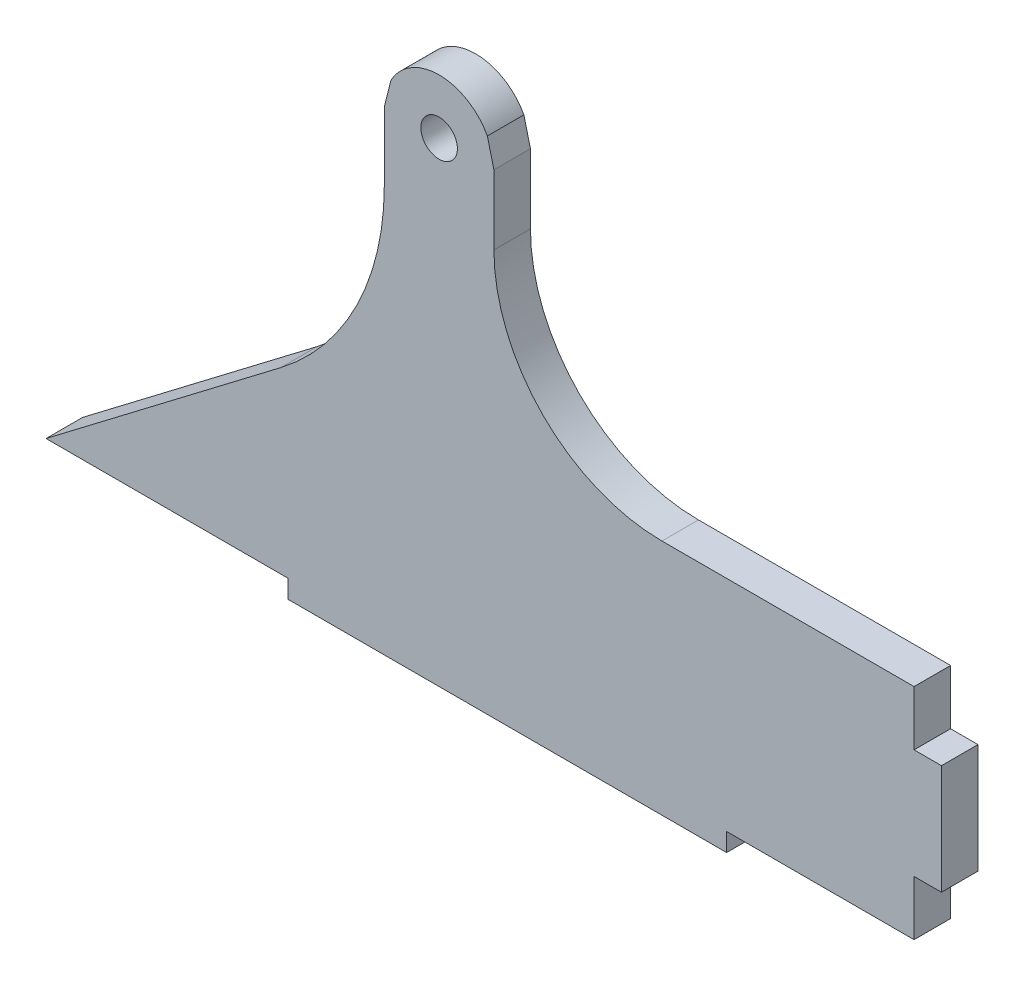
ISO-10303-21;
HEADER;
FILE_DESCRIPTION(('STEP AP214'),'2;1');
FILE_NAME('part.step','',(''),(''),'','','');
FILE_SCHEMA(('AUTOMOTIVE_DESIGN { 1 0 10303 214 1 1 1 1 }'));
ENDSEC;
DATA;
#1=APPLICATION_CONTEXT('core data for automotive mechanical design processes');
#2=APPLICATION_PROTOCOL_DEFINITION('international standard','automotive_design',2000,#1);
#3=PRODUCT_CONTEXT('',#1,'mechanical');
#4=PRODUCT('Part','Part','',(#3));
#5=PRODUCT_RELATED_PRODUCT_CATEGORY('part','',(#4));
#6=PRODUCT_DEFINITION_FORMATION('','',#4);
#7=PRODUCT_DEFINITION_CONTEXT('part definition',#1,'design');
#8=PRODUCT_DEFINITION('design','',#6,#7);
#9=PRODUCT_DEFINITION_SHAPE('','',#8);
#10=(LENGTH_UNIT() NAMED_UNIT(*) SI_UNIT(.MILLI.,.METRE.));
#11=(NAMED_UNIT(*) PLANE_ANGLE_UNIT() SI_UNIT($,.RADIAN.));
#12=(NAMED_UNIT(*) SI_UNIT($,.STERADIAN.) SOLID_ANGLE_UNIT());
#13=UNCERTAINTY_MEASURE_WITH_UNIT(LENGTH_MEASURE(1.E-05),#10,'distance_accuracy_value','');
#14=(GEOMETRIC_REPRESENTATION_CONTEXT(3) GLOBAL_UNCERTAINTY_ASSIGNED_CONTEXT((#13)) GLOBAL_UNIT_ASSIGNED_CONTEXT((#10,
#11,#12)) REPRESENTATION_CONTEXT('',''));
#15=CARTESIAN_POINT('',(0.,0.,0.));
#16=DIRECTION('',(0.,0.,1.));
#17=DIRECTION('',(1.,0.,0.));
#18=AXIS2_PLACEMENT_3D('',#15,#16,#17);
#19=CARTESIAN_POINT('',(-54.3464769765245,0.,12.7));
#20=DIRECTION('',(1.,0.,0.));
#21=DIRECTION('',(0.,1.,0.));
#22=AXIS2_PLACEMENT_3D('',#19,#20,#21);
#23=PLANE('',#22);
#24=DIRECTION('',(0.,-1.,0.));
#25=VECTOR('',#24,1.);
#26=CARTESIAN_POINT('',(-54.3464769765245,0.,0.));
#27=LINE('',#26,#25);
#28=CARTESIAN_POINT('',(-54.3464769765246,115.328667430171,0.));
#29=VERTEX_POINT('',#28);
#30=CARTESIAN_POINT('',(-54.3464769765246,91.4382890086782,0.));
#31=VERTEX_POINT('',#30);
#32=EDGE_CURVE('E204',#29,#31,#27,.T.);
#33=ORIENTED_EDGE('',*,*,#32,.T.);
#34=DIRECTION('',(0.,0.,-1.));
#35=VECTOR('',#34,1.);
#36=CARTESIAN_POINT('',(-54.3464769765246,91.4382890086782,12.7));
#37=LINE('',#36,#35);
#38=CARTESIAN_POINT('',(-54.3464769765246,91.4382890086782,12.7));
#39=VERTEX_POINT('',#38);
#40=EDGE_CURVE('E11',#39,#31,#37,.T.);
#41=ORIENTED_EDGE('',*,*,#40,.F.);
#42=DIRECTION('',(0.,-1.,0.));
#43=VECTOR('',#42,1.);
#44=CARTESIAN_POINT('',(-54.3464769765245,0.,12.7));
#45=LINE('',#44,#43);
#46=CARTESIAN_POINT('',(-54.3464769765246,115.328667430171,12.7));
#47=VERTEX_POINT('',#46);
#48=EDGE_CURVE('E345',#47,#39,#45,.T.);
#49=ORIENTED_EDGE('',*,*,#48,.F.);
#50=DIRECTION('',(0.,0.,-1.));
#51=VECTOR('',#50,1.);
#52=CARTESIAN_POINT('',(-54.3464769765246,115.328667430171,12.7));
#53=LINE('',#52,#51);
#54=EDGE_CURVE('E197',#47,#29,#53,.T.);
#55=ORIENTED_EDGE('',*,*,#54,.T.);
#56=EDGE_LOOP('',(#33,#41,#49,#55));
#57=FACE_BOUND('',#56,.T.);
#58=ADVANCED_FACE('F38',(#57),#23,.F.);
#59=CARTESIAN_POINT('',(-145.786476976525,91.4382890086777,12.7));
#60=DIRECTION('',(0.,0.,-1.));
#61=DIRECTION('',(-1.,0.,0.));
#62=AXIS2_PLACEMENT_3D('',#59,#60,#61);
#63=CYLINDRICAL_SURFACE('',#62,91.44);
#64=CARTESIAN_POINT('',(-145.786476976525,91.4382890086777,0.));
#65=DIRECTION('',(0.,0.,1.));
#66=DIRECTION('',(1.,0.,0.));
#67=AXIS2_PLACEMENT_3D('',#64,#65,#66);
#68=CIRCLE('',#67,91.44);
#69=CARTESIAN_POINT('',(-90.3866865866166,18.6912146705694,0.));
#70=VERTEX_POINT('',#69);
#71=EDGE_CURVE('E207',#31,#70,#68,.F.);
#72=ORIENTED_EDGE('',*,*,#71,.T.);
#73=DIRECTION('',(0.,0.,-1.));
#74=VECTOR('',#73,1.);
#75=CARTESIAN_POINT('',(-90.3866865866166,18.6912146705694,12.7));
#76=LINE('',#75,#74);
#77=CARTESIAN_POINT('',(-90.3866865866166,18.6912146705694,12.7));
#78=VERTEX_POINT('',#77);
#79=EDGE_CURVE('E47',#78,#70,#76,.T.);
#80=ORIENTED_EDGE('',*,*,#79,.F.);
#81=CARTESIAN_POINT('',(-145.786476976525,91.4382890086777,12.7));
#82=DIRECTION('',(0.,0.,1.));
#83=DIRECTION('',(1.,0.,0.));
#84=AXIS2_PLACEMENT_3D('',#81,#82,#83);
#85=CIRCLE('',#84,91.44);
#86=EDGE_CURVE('E131',#39,#78,#85,.F.);
#87=ORIENTED_EDGE('',*,*,#86,.F.);
#88=ORIENTED_EDGE('',*,*,#40,.T.);
#89=EDGE_LOOP('',(#72,#80,#87,#88));
#90=FACE_BOUND('',#89,.T.);
#91=ADVANCED_FACE('F359',(#90),#63,.F.);
#92=CARTESIAN_POINT('',(-42.187104883936,55.3971131208522,12.7));
#93=DIRECTION('',(0.605859474955253,-0.795571679113168,0.));
#94=DIRECTION('',(0.795571679113168,0.605859474955253,0.));
#95=AXIS2_PLACEMENT_3D('',#92,#93,#94);
#96=PLANE('',#95);
#97=DIRECTION('',(-0.795571679113168,-0.605859474955253,0.));
#98=VECTOR('',#97,1.);
#99=CARTESIAN_POINT('',(-42.187104883936,55.3971131208522,0.));
#100=LINE('',#99,#98);
#101=CARTESIAN_POINT('',(-171.948476976525,-43.4213325698294,0.));
#102=VERTEX_POINT('',#101);
#103=EDGE_CURVE('E209',#70,#102,#100,.T.);
#104=ORIENTED_EDGE('',*,*,#103,.T.);
#105=DIRECTION('',(0.,0.,-1.));
#106=VECTOR('',#105,1.);
#107=CARTESIAN_POINT('',(-171.948476976525,-43.4213325698294,12.7));
#108=LINE('',#107,#106);
#109=CARTESIAN_POINT('',(-171.948476976525,-43.4213325698294,12.7));
#110=VERTEX_POINT('',#109);
#111=EDGE_CURVE('E280',#110,#102,#108,.T.);
#112=ORIENTED_EDGE('',*,*,#111,.F.);
#113=DIRECTION('',(-0.795571679113168,-0.605859474955253,0.));
#114=VECTOR('',#113,1.);
#115=CARTESIAN_POINT('',(-42.187104883936,55.3971131208522,12.7));
#116=LINE('',#115,#114);
#117=EDGE_CURVE('E288',#78,#110,#116,.T.);
#118=ORIENTED_EDGE('',*,*,#117,.F.);
#119=ORIENTED_EDGE('',*,*,#79,.T.);
#120=EDGE_LOOP('',(#104,#112,#118,#119));
#121=FACE_BOUND('',#120,.T.);
#122=ADVANCED_FACE('F286',(#121),#96,.F.);
#123=CARTESIAN_POINT('',(0.,-43.4213325698294,12.7));
#124=DIRECTION('',(0.,1.,0.));
#125=DIRECTION('',(0.,0.,1.));
#126=AXIS2_PLACEMENT_3D('',#123,#124,#125);
#127=PLANE('',#126);
#128=DIRECTION('',(1.,0.,0.));
#129=VECTOR('',#128,1.);
#130=CARTESIAN_POINT('',(0.,-43.4213325698294,0.));
#131=LINE('',#130,#129);
#132=CARTESIAN_POINT('',(-87.7474769765246,-43.4213325698294,0.));
#133=VERTEX_POINT('',#132);
#134=EDGE_CURVE('E211',#102,#133,#131,.T.);
#135=ORIENTED_EDGE('',*,*,#134,.T.);
#136=DIRECTION('',(0.,0.,-1.));
#137=VECTOR('',#136,1.);
#138=CARTESIAN_POINT('',(-87.7474769765246,-43.4213325698294,12.7));
#139=LINE('',#138,#137);
#140=CARTESIAN_POINT('',(-87.7474769765246,-43.4213325698294,12.7));
#141=VERTEX_POINT('',#140);
#142=EDGE_CURVE('E277',#141,#133,#139,.T.);
#143=ORIENTED_EDGE('',*,*,#142,.F.);
#144=DIRECTION('',(1.,0.,0.));
#145=VECTOR('',#144,1.);
#146=CARTESIAN_POINT('',(0.,-43.4213325698294,12.7));
#147=LINE('',#146,#145);
#148=EDGE_CURVE('E306',#110,#141,#147,.T.);
#149=ORIENTED_EDGE('',*,*,#148,.F.);
#150=ORIENTED_EDGE('',*,*,#111,.T.);
#151=EDGE_LOOP('',(#135,#143,#149,#150));
#152=FACE_BOUND('',#151,.T.);
#153=ADVANCED_FACE('F297',(#152),#127,.F.);
#154=CARTESIAN_POINT('',(-87.7474769765246,0.,12.7));
#155=DIRECTION('',(1.,0.,0.));
#156=DIRECTION('',(0.,0.,-1.));
#157=AXIS2_PLACEMENT_3D('',#154,#155,#156);
#158=PLANE('',#157);
#159=DIRECTION('',(0.,-1.,0.));
#160=VECTOR('',#159,1.);
#161=CARTESIAN_POINT('',(-87.7474769765246,0.,0.));
#162=LINE('',#161,#160);
#163=CARTESIAN_POINT('',(-87.7474769765246,-49.7713325698294,0.));
#164=VERTEX_POINT('',#163);
#165=EDGE_CURVE('E213',#133,#164,#162,.T.);
#166=ORIENTED_EDGE('',*,*,#165,.T.);
#167=DIRECTION('',(0.,0.,-1.));
#168=VECTOR('',#167,1.);
#169=CARTESIAN_POINT('',(-87.7474769765246,-49.7713325698294,12.7));
#170=LINE('',#169,#168);
#171=CARTESIAN_POINT('',(-87.7474769765246,-49.7713325698294,12.7));
#172=VERTEX_POINT('',#171);
#173=EDGE_CURVE('E274',#172,#164,#170,.T.);
#174=ORIENTED_EDGE('',*,*,#173,.F.);
#175=DIRECTION('',(0.,-1.,0.));
#176=VECTOR('',#175,1.);
#177=CARTESIAN_POINT('',(-87.7474769765246,0.,12.7));
#178=LINE('',#177,#176);
#179=EDGE_CURVE('E303',#141,#172,#178,.T.);
#180=ORIENTED_EDGE('',*,*,#179,.F.);
#181=ORIENTED_EDGE('',*,*,#142,.T.);
#182=EDGE_LOOP('',(#166,#174,#180,#181));
#183=FACE_BOUND('',#182,.T.);
#184=ADVANCED_FACE('F301',(#183),#158,.F.);
#185=CARTESIAN_POINT('',(0.,-49.7713325698294,12.7));
#186=DIRECTION('',(0.,1.,0.));
#187=DIRECTION('',(-1.,0.,0.));
#188=AXIS2_PLACEMENT_3D('',#185,#186,#187);
#189=PLANE('',#188);
#190=DIRECTION('',(1.,0.,0.));
#191=VECTOR('',#190,1.);
#192=CARTESIAN_POINT('',(0.,-49.7713325698294,0.));
#193=LINE('',#192,#191);
#194=CARTESIAN_POINT('',(64.6525230234755,-49.7713325698294,0.));
#195=VERTEX_POINT('',#194);
#196=EDGE_CURVE('E215',#164,#195,#193,.T.);
#197=ORIENTED_EDGE('',*,*,#196,.T.);
#198=DIRECTION('',(0.,0.,-1.));
#199=VECTOR('',#198,1.);
#200=CARTESIAN_POINT('',(64.6525230234755,-49.7713325698294,12.7));
#201=LINE('',#200,#199);
#202=CARTESIAN_POINT('',(64.6525230234755,-49.7713325698294,12.7));
#203=VERTEX_POINT('',#202);
#204=EDGE_CURVE('E271',#203,#195,#201,.T.);
#205=ORIENTED_EDGE('',*,*,#204,.F.);
#206=DIRECTION('',(1.,0.,0.));
#207=VECTOR('',#206,1.);
#208=CARTESIAN_POINT('',(0.,-49.7713325698294,12.7));
#209=LINE('',#208,#207);
#210=EDGE_CURVE('E305',#172,#203,#209,.T.);
#211=ORIENTED_EDGE('',*,*,#210,.F.);
#212=ORIENTED_EDGE('',*,*,#173,.T.);
#213=EDGE_LOOP('',(#197,#205,#211,#212));
#214=FACE_BOUND('',#213,.T.);
#215=ADVANCED_FACE('F371',(#214),#189,.F.);
#216=CARTESIAN_POINT('',(64.6525230234755,0.,12.7));
#217=DIRECTION('',(-1.,0.,0.));
#218=DIRECTION('',(0.,0.,1.));
#219=AXIS2_PLACEMENT_3D('',#216,#217,#218);
#220=PLANE('',#219);
#221=DIRECTION('',(0.,1.,0.));
#222=VECTOR('',#221,1.);
#223=CARTESIAN_POINT('',(64.6525230234755,0.,0.));
#224=LINE('',#223,#222);
#225=CARTESIAN_POINT('',(64.6525230234755,-43.4213325698294,0.));
#226=VERTEX_POINT('',#225);
#227=EDGE_CURVE('E217',#195,#226,#224,.T.);
#228=ORIENTED_EDGE('',*,*,#227,.T.);
#229=DIRECTION('',(0.,0.,-1.));
#230=VECTOR('',#229,1.);
#231=CARTESIAN_POINT('',(64.6525230234755,-43.4213325698294,12.7));
#232=LINE('',#231,#230);
#233=CARTESIAN_POINT('',(64.6525230234755,-43.4213325698294,12.7));
#234=VERTEX_POINT('',#233);
#235=EDGE_CURVE('E268',#234,#226,#232,.T.);
#236=ORIENTED_EDGE('',*,*,#235,.F.);
#237=DIRECTION('',(0.,1.,0.));
#238=VECTOR('',#237,1.);
#239=CARTESIAN_POINT('',(64.6525230234755,0.,12.7));
#240=LINE('',#239,#238);
#241=EDGE_CURVE('E308',#203,#234,#240,.T.);
#242=ORIENTED_EDGE('',*,*,#241,.F.);
#243=ORIENTED_EDGE('',*,*,#204,.T.);
#244=EDGE_LOOP('',(#228,#236,#242,#243));
#245=FACE_BOUND('',#244,.T.);
#246=ADVANCED_FACE('F374',(#245),#220,.F.);
#247=CARTESIAN_POINT('',(0.,-43.4213325698294,12.7));
#248=DIRECTION('',(0.,1.,0.));
#249=DIRECTION('',(-1.,0.,0.));
#250=AXIS2_PLACEMENT_3D('',#247,#248,#249);
#251=PLANE('',#250);
#252=DIRECTION('',(1.,0.,0.));
#253=VECTOR('',#252,1.);
#254=CARTESIAN_POINT('',(0.,-43.4213325698294,0.));
#255=LINE('',#254,#253);
#256=CARTESIAN_POINT('',(129.803523023475,-43.4213325698294,0.));
#257=VERTEX_POINT('',#256);
#258=EDGE_CURVE('E219',#226,#257,#255,.T.);
#259=ORIENTED_EDGE('',*,*,#258,.T.);
#260=DIRECTION('',(0.,0.,-1.));
#261=VECTOR('',#260,1.);
#262=CARTESIAN_POINT('',(129.803523023475,-43.4213325698294,12.7));
#263=LINE('',#262,#261);
#264=CARTESIAN_POINT('',(129.803523023475,-43.4213325698294,12.7));
#265=VERTEX_POINT('',#264);
#266=EDGE_CURVE('E265',#265,#257,#263,.T.);
#267=ORIENTED_EDGE('',*,*,#266,.F.);
#268=DIRECTION('',(1.,0.,0.));
#269=VECTOR('',#268,1.);
#270=CARTESIAN_POINT('',(0.,-43.4213325698294,12.7));
#271=LINE('',#270,#269);
#272=EDGE_CURVE('E314',#234,#265,#271,.T.);
#273=ORIENTED_EDGE('',*,*,#272,.F.);
#274=ORIENTED_EDGE('',*,*,#235,.T.);
#275=EDGE_LOOP('',(#259,#267,#273,#274));
#276=FACE_BOUND('',#275,.T.);
#277=ADVANCED_FACE('F378',(#276),#251,.F.);
#278=CARTESIAN_POINT('',(129.803523023475,0.,12.7));
#279=DIRECTION('',(-1.,0.,0.));
#280=DIRECTION('',(0.,0.,1.));
#281=AXIS2_PLACEMENT_3D('',#278,#279,#280);
#282=PLANE('',#281);
#283=DIRECTION('',(0.,1.,0.));
#284=VECTOR('',#283,1.);
#285=CARTESIAN_POINT('',(129.803523023475,0.,0.));
#286=LINE('',#285,#284);
#287=CARTESIAN_POINT('',(129.803523023475,-24.3713325698294,0.));
#288=VERTEX_POINT('',#287);
#289=EDGE_CURVE('E221',#257,#288,#286,.T.);
#290=ORIENTED_EDGE('',*,*,#289,.T.);
#291=DIRECTION('',(0.,0.,-1.));
#292=VECTOR('',#291,1.);
#293=CARTESIAN_POINT('',(129.803523023475,-24.3713325698294,12.7));
#294=LINE('',#293,#292);
#295=CARTESIAN_POINT('',(129.803523023475,-24.3713325698294,12.7));
#296=VERTEX_POINT('',#295);
#297=EDGE_CURVE('E263',#296,#288,#294,.T.);
#298=ORIENTED_EDGE('',*,*,#297,.F.);
#299=DIRECTION('',(0.,1.,0.));
#300=VECTOR('',#299,1.);
#301=CARTESIAN_POINT('',(129.803523023475,0.,12.7));
#302=LINE('',#301,#300);
#303=EDGE_CURVE('E316',#265,#296,#302,.T.);
#304=ORIENTED_EDGE('',*,*,#303,.F.);
#305=ORIENTED_EDGE('',*,*,#266,.T.);
#306=EDGE_LOOP('',(#290,#298,#304,#305));
#307=FACE_BOUND('',#306,.T.);
#308=ADVANCED_FACE('F382',(#307),#282,.F.);
#309=CARTESIAN_POINT('',(0.,-24.3713325698294,12.7));
#310=DIRECTION('',(0.,-1.,0.));
#311=DIRECTION('',(0.,0.,-1.));
#312=AXIS2_PLACEMENT_3D('',#309,#310,#311);
#313=PLANE('',#312);
#314=DIRECTION('',(-1.,0.,0.));
#315=VECTOR('',#314,1.);
#316=CARTESIAN_POINT('',(0.,-24.3713325698294,0.));
#317=LINE('',#316,#315);
#318=CARTESIAN_POINT('',(139.328523023475,-24.3713325698294,0.));
#319=VERTEX_POINT('',#318);
#320=EDGE_CURVE('E224',#319,#288,#317,.T.);
#321=ORIENTED_EDGE('',*,*,#320,.F.);
#322=DIRECTION('',(0.,0.,-1.));
#323=VECTOR('',#322,1.);
#324=CARTESIAN_POINT('',(139.328523023475,-24.3713325698294,12.7));
#325=LINE('',#324,#323);
#326=CARTESIAN_POINT('',(139.328523023475,-24.3713325698294,12.7));
#327=VERTEX_POINT('',#326);
#328=EDGE_CURVE('E261',#327,#319,#325,.T.);
#329=ORIENTED_EDGE('',*,*,#328,.F.);
#330=DIRECTION('',(-1.,0.,0.));
#331=VECTOR('',#330,1.);
#332=CARTESIAN_POINT('',(0.,-24.3713325698294,12.7));
#333=LINE('',#332,#331);
#334=EDGE_CURVE('E318',#327,#296,#333,.T.);
#335=ORIENTED_EDGE('',*,*,#334,.T.);
#336=ORIENTED_EDGE('',*,*,#297,.T.);
#337=EDGE_LOOP('',(#321,#329,#335,#336));
#338=FACE_BOUND('',#337,.T.);
#339=ADVANCED_FACE('F386',(#338),#313,.T.);
#340=CARTESIAN_POINT('',(139.328523023475,0.,12.7));
#341=DIRECTION('',(1.,0.,0.));
#342=DIRECTION('',(0.,0.,-1.));
#343=AXIS2_PLACEMENT_3D('',#340,#341,#342);
#344=PLANE('',#343);
#345=DIRECTION('',(0.,-1.,0.));
#346=VECTOR('',#345,1.);
#347=CARTESIAN_POINT('',(139.328523023475,0.,0.));
#348=LINE('',#347,#346);
#349=CARTESIAN_POINT('',(139.328523023475,13.7286674301706,0.));
#350=VERTEX_POINT('',#349);
#351=EDGE_CURVE('E227',#350,#319,#348,.T.);
#352=ORIENTED_EDGE('',*,*,#351,.F.);
#353=DIRECTION('',(0.,0.,-1.));
#354=VECTOR('',#353,1.);
#355=CARTESIAN_POINT('',(139.328523023475,13.7286674301706,12.7));
#356=LINE('',#355,#354);
#357=CARTESIAN_POINT('',(139.328523023475,13.7286674301706,12.7));
#358=VERTEX_POINT('',#357);
#359=EDGE_CURVE('E259',#358,#350,#356,.T.);
#360=ORIENTED_EDGE('',*,*,#359,.F.);
#361=DIRECTION('',(0.,-1.,0.));
#362=VECTOR('',#361,1.);
#363=CARTESIAN_POINT('',(139.328523023475,0.,12.7));
#364=LINE('',#363,#362);
#365=EDGE_CURVE('E321',#358,#327,#364,.T.);
#366=ORIENTED_EDGE('',*,*,#365,.T.);
#367=ORIENTED_EDGE('',*,*,#328,.T.);
#368=EDGE_LOOP('',(#352,#360,#366,#367));
#369=FACE_BOUND('',#368,.T.);
#370=ADVANCED_FACE('F390',(#369),#344,.T.);
#371=CARTESIAN_POINT('',(0.,13.7286674301706,12.7));
#372=DIRECTION('',(0.,1.,0.));
#373=DIRECTION('',(0.,0.,1.));
#374=AXIS2_PLACEMENT_3D('',#371,#372,#373);
#375=PLANE('',#374);
#376=DIRECTION('',(1.,0.,0.));
#377=VECTOR('',#376,1.);
#378=CARTESIAN_POINT('',(0.,13.7286674301706,0.));
#379=LINE('',#378,#377);
#380=CARTESIAN_POINT('',(129.803523023475,13.7286674301706,0.));
#381=VERTEX_POINT('',#380);
#382=EDGE_CURVE('E230',#381,#350,#379,.T.);
#383=ORIENTED_EDGE('',*,*,#382,.F.);
#384=DIRECTION('',(0.,0.,-1.));
#385=VECTOR('',#384,1.);
#386=CARTESIAN_POINT('',(129.803523023475,13.7286674301706,12.7));
#387=LINE('',#386,#385);
#388=CARTESIAN_POINT('',(129.803523023475,13.7286674301706,12.7));
#389=VERTEX_POINT('',#388);
#390=EDGE_CURVE('E257',#389,#381,#387,.T.);
#391=ORIENTED_EDGE('',*,*,#390,.F.);
#392=DIRECTION('',(1.,0.,0.));
#393=VECTOR('',#392,1.);
#394=CARTESIAN_POINT('',(0.,13.7286674301706,12.7));
#395=LINE('',#394,#393);
#396=EDGE_CURVE('E324',#389,#358,#395,.T.);
#397=ORIENTED_EDGE('',*,*,#396,.T.);
#398=ORIENTED_EDGE('',*,*,#359,.T.);
#399=EDGE_LOOP('',(#383,#391,#397,#398));
#400=FACE_BOUND('',#399,.T.);
#401=ADVANCED_FACE('F394',(#400),#375,.T.);
#402=CARTESIAN_POINT('',(129.803523023475,-1.89121863435858E-13,12.7));
#403=DIRECTION('',(-1.,0.,0.));
#404=DIRECTION('',(0.,-1.,0.));
#405=AXIS2_PLACEMENT_3D('',#402,#403,#404);
#406=PLANE('',#405);
#407=DIRECTION('',(0.,1.,0.));
#408=VECTOR('',#407,1.);
#409=CARTESIAN_POINT('',(129.803523023475,-1.89121863435858E-13,0.));
#410=LINE('',#409,#408);
#411=CARTESIAN_POINT('',(129.803523023475,32.7786674301706,0.));
#412=VERTEX_POINT('',#411);
#413=EDGE_CURVE('E233',#381,#412,#410,.T.);
#414=ORIENTED_EDGE('',*,*,#413,.T.);
#415=DIRECTION('',(0.,0.,-1.));
#416=VECTOR('',#415,1.);
#417=CARTESIAN_POINT('',(129.803523023475,32.7786674301706,12.7));
#418=LINE('',#417,#416);
#419=CARTESIAN_POINT('',(129.803523023475,32.7786674301706,12.7));
#420=VERTEX_POINT('',#419);
#421=EDGE_CURVE('E254',#420,#412,#418,.T.);
#422=ORIENTED_EDGE('',*,*,#421,.F.);
#423=DIRECTION('',(0.,1.,0.));
#424=VECTOR('',#423,1.);
#425=CARTESIAN_POINT('',(129.803523023475,-1.89121863435858E-13,12.7));
#426=LINE('',#425,#424);
#427=EDGE_CURVE('E327',#389,#420,#426,.T.);
#428=ORIENTED_EDGE('',*,*,#427,.F.);
#429=ORIENTED_EDGE('',*,*,#390,.T.);
#430=EDGE_LOOP('',(#414,#422,#428,#429));
#431=FACE_BOUND('',#430,.T.);
#432=ADVANCED_FACE('F398',(#431),#406,.F.);
#433=CARTESIAN_POINT('',(0.,32.7786674301706,12.7));
#434=DIRECTION('',(0.,-1.,0.));
#435=DIRECTION('',(1.,0.,0.));
#436=AXIS2_PLACEMENT_3D('',#433,#434,#435);
#437=PLANE('',#436);
#438=DIRECTION('',(-1.,0.,0.));
#439=VECTOR('',#438,1.);
#440=CARTESIAN_POINT('',(0.,32.7786674301706,0.));
#441=LINE('',#440,#439);
#442=CARTESIAN_POINT('',(42.1735230234758,32.7786674301706,0.));
#443=VERTEX_POINT('',#442);
#444=EDGE_CURVE('E235',#412,#443,#441,.T.);
#445=ORIENTED_EDGE('',*,*,#444,.T.);
#446=DIRECTION('',(0.,0.,-1.));
#447=VECTOR('',#446,1.);
#448=CARTESIAN_POINT('',(42.1735230234758,32.7786674301706,12.7));
#449=LINE('',#448,#447);
#450=CARTESIAN_POINT('',(42.1735230234758,32.7786674301706,12.7));
#451=VERTEX_POINT('',#450);
#452=EDGE_CURVE('E251',#451,#443,#449,.T.);
#453=ORIENTED_EDGE('',*,*,#452,.F.);
#454=DIRECTION('',(-1.,0.,0.));
#455=VECTOR('',#454,1.);
#456=CARTESIAN_POINT('',(0.,32.7786674301706,12.7));
#457=LINE('',#456,#455);
#458=EDGE_CURVE('E329',#420,#451,#457,.T.);
#459=ORIENTED_EDGE('',*,*,#458,.F.);
#460=ORIENTED_EDGE('',*,*,#421,.T.);
#461=EDGE_LOOP('',(#445,#453,#459,#460));
#462=FACE_BOUND('',#461,.T.);
#463=ADVANCED_FACE('F402',(#462),#437,.F.);
#464=CARTESIAN_POINT('',(42.1735230234754,91.1986674301706,12.7));
#465=DIRECTION('',(0.,0.,-1.));
#466=DIRECTION('',(-1.,0.,0.));
#467=AXIS2_PLACEMENT_3D('',#464,#465,#466);
#468=CYLINDRICAL_SURFACE('',#467,58.42);
#469=CARTESIAN_POINT('',(42.1735230234754,91.1986674301706,0.));
#470=DIRECTION('',(0.,0.,1.));
#471=DIRECTION('',(1.,0.,0.));
#472=AXIS2_PLACEMENT_3D('',#469,#470,#471);
#473=CIRCLE('',#472,58.42);
#474=CARTESIAN_POINT('',(-16.2464769765246,91.198667430171,0.));
#475=VERTEX_POINT('',#474);
#476=EDGE_CURVE('E237',#443,#475,#473,.F.);
#477=ORIENTED_EDGE('',*,*,#476,.T.);
#478=DIRECTION('',(0.,0.,-1.));
#479=VECTOR('',#478,1.);
#480=CARTESIAN_POINT('',(-16.2464769765246,91.198667430171,12.7));
#481=LINE('',#480,#479);
#482=CARTESIAN_POINT('',(-16.2464769765246,91.198667430171,12.7));
#483=VERTEX_POINT('',#482);
#484=EDGE_CURVE('E248',#483,#475,#481,.T.);
#485=ORIENTED_EDGE('',*,*,#484,.F.);
#486=CARTESIAN_POINT('',(42.1735230234754,91.1986674301706,12.7));
#487=DIRECTION('',(0.,0.,1.));
#488=DIRECTION('',(1.,0.,0.));
#489=AXIS2_PLACEMENT_3D('',#486,#487,#488);
#490=CIRCLE('',#489,58.42);
#491=EDGE_CURVE('E331',#451,#483,#490,.F.);
#492=ORIENTED_EDGE('',*,*,#491,.F.);
#493=ORIENTED_EDGE('',*,*,#452,.T.);
#494=EDGE_LOOP('',(#477,#485,#492,#493));
#495=FACE_BOUND('',#494,.T.);
#496=ADVANCED_FACE('F337',(#495),#468,.F.);
#497=CARTESIAN_POINT('',(-16.2464769765246,0.,12.7));
#498=DIRECTION('',(-1.,0.,0.));
#499=DIRECTION('',(0.,0.,1.));
#500=AXIS2_PLACEMENT_3D('',#497,#498,#499);
#501=PLANE('',#500);
#502=DIRECTION('',(0.,1.,0.));
#503=VECTOR('',#502,1.);
#504=CARTESIAN_POINT('',(-16.2464769765246,0.,0.));
#505=LINE('',#504,#503);
#506=CARTESIAN_POINT('',(-16.2464769765246,115.328667430171,0.));
#507=VERTEX_POINT('',#506);
#508=EDGE_CURVE('E239',#475,#507,#505,.T.);
#509=ORIENTED_EDGE('',*,*,#508,.T.);
#510=DIRECTION('',(0.,0.,-1.));
#511=VECTOR('',#510,1.);
#512=CARTESIAN_POINT('',(-16.2464769765246,115.328667430171,12.7));
#513=LINE('',#512,#511);
#514=CARTESIAN_POINT('',(-16.2464769765246,115.328667430171,12.7));
#515=VERTEX_POINT('',#514);
#516=EDGE_CURVE('E192',#515,#507,#513,.T.);
#517=ORIENTED_EDGE('',*,*,#516,.F.);
#518=DIRECTION('',(0.,1.,0.));
#519=VECTOR('',#518,1.);
#520=CARTESIAN_POINT('',(-16.2464769765246,0.,12.7));
#521=LINE('',#520,#519);
#522=EDGE_CURVE('E183',#483,#515,#521,.T.);
#523=ORIENTED_EDGE('',*,*,#522,.F.);
#524=ORIENTED_EDGE('',*,*,#484,.T.);
#525=EDGE_LOOP('',(#509,#517,#523,#524));
#526=FACE_BOUND('',#525,.T.);
#527=ADVANCED_FACE('F341',(#526),#501,.F.);
#528=CARTESIAN_POINT('',(12.0911043060892,3.05167280450195,12.7));
#529=DIRECTION('',(-0.969594813281753,-0.244715953826314,0.));
#530=DIRECTION('',(0.244715953826314,-0.969594813281753,0.));
#531=AXIS2_PLACEMENT_3D('',#528,#529,#530);
#532=PLANE('',#531);
#533=DIRECTION('',(-0.244715953826314,0.969594813281753,0.));
#534=VECTOR('',#533,1.);
#535=CARTESIAN_POINT('',(12.0911043060892,3.05167280450195,0.));
#536=LINE('',#535,#534);
#537=CARTESIAN_POINT('',(-18.528129692501,124.368857105303,0.));
#538=VERTEX_POINT('',#537);
#539=EDGE_CURVE('E191',#507,#538,#536,.T.);
#540=ORIENTED_EDGE('',*,*,#539,.T.);
#541=DIRECTION('',(0.,0.,-1.));
#542=VECTOR('',#541,1.);
#543=CARTESIAN_POINT('',(-18.528129692501,124.368857105303,12.7));
#544=LINE('',#543,#542);
#545=CARTESIAN_POINT('',(-18.528129692501,124.368857105303,12.7));
#546=VERTEX_POINT('',#545);
#547=EDGE_CURVE('E188',#546,#538,#544,.T.);
#548=ORIENTED_EDGE('',*,*,#547,.F.);
#549=DIRECTION('',(-0.244715953826314,0.969594813281753,0.));
#550=VECTOR('',#549,1.);
#551=CARTESIAN_POINT('',(12.0911043060892,3.05167280450195,12.7));
#552=LINE('',#551,#550);
#553=EDGE_CURVE('E177',#515,#546,#552,.T.);
#554=ORIENTED_EDGE('',*,*,#553,.F.);
#555=ORIENTED_EDGE('',*,*,#516,.T.);
#556=EDGE_LOOP('',(#540,#548,#554,#555));
#557=FACE_BOUND('',#556,.T.);
#558=ADVANCED_FACE('F189',(#557),#532,.F.);
#559=CARTESIAN_POINT('',(-35.2964769765246,115.328667430171,12.7));
#560=DIRECTION('',(0.,0.,-1.));
#561=DIRECTION('',(-1.,0.,0.));
#562=AXIS2_PLACEMENT_3D('',#559,#560,#561);
#563=CYLINDRICAL_SURFACE('',#562,19.05);
#564=CARTESIAN_POINT('',(-35.2964769765246,115.328667430171,0.));
#565=DIRECTION('',(0.,0.,1.));
#566=DIRECTION('',(1.,0.,0.));
#567=AXIS2_PLACEMENT_3D('',#564,#565,#566);
#568=CIRCLE('',#567,19.05);
#569=CARTESIAN_POINT('',(-52.0648242605482,124.368857105303,0.));
#570=VERTEX_POINT('',#569);
#571=EDGE_CURVE('E117',#538,#570,#568,.T.);
#572=ORIENTED_EDGE('',*,*,#571,.T.);
#573=DIRECTION('',(0.,0.,-1.));
#574=VECTOR('',#573,1.);
#575=CARTESIAN_POINT('',(-52.0648242605482,124.368857105303,12.7));
#576=LINE('',#575,#574);
#577=CARTESIAN_POINT('',(-52.0648242605482,124.368857105303,12.7));
#578=VERTEX_POINT('',#577);
#579=EDGE_CURVE('E193',#578,#570,#576,.T.);
#580=ORIENTED_EDGE('',*,*,#579,.F.);
#581=CARTESIAN_POINT('',(-35.2964769765246,115.328667430171,12.7));
#582=DIRECTION('',(0.,0.,1.));
#583=DIRECTION('',(1.,0.,0.));
#584=AXIS2_PLACEMENT_3D('',#581,#582,#583);
#585=CIRCLE('',#584,19.05);
#586=EDGE_CURVE('E181',#546,#578,#585,.T.);
#587=ORIENTED_EDGE('',*,*,#586,.F.);
#588=ORIENTED_EDGE('',*,*,#547,.T.);
#589=EDGE_LOOP('',(#572,#580,#587,#588));
#590=FACE_BOUND('',#589,.T.);
#591=ADVANCED_FACE('F195',(#590),#563,.T.);
#592=CARTESIAN_POINT('',(-35.2964769765246,115.328667430171,12.7));
#593=DIRECTION('',(0.,0.,-1.));
#594=DIRECTION('',(-1.,0.,0.));
#595=AXIS2_PLACEMENT_3D('',#592,#593,#594);
#596=CYLINDRICAL_SURFACE('',#595,6.34999999999997);
#597=CARTESIAN_POINT('',(-35.2964769765246,115.328667430171,12.7));
#598=DIRECTION('',(0.,0.,1.));
#599=DIRECTION('',(1.,0.,0.));
#600=AXIS2_PLACEMENT_3D('',#597,#598,#599);
#601=CIRCLE('',#600,6.34999999999997);
#602=CARTESIAN_POINT('',(-28.9464769765247,115.328667430171,12.7));
#603=VERTEX_POINT('',#602);
#604=EDGE_CURVE('E244',#603,#603,#601,.T.);
#605=ORIENTED_EDGE('',*,*,#604,.T.);
#606=EDGE_LOOP('',(#605));
#607=FACE_BOUND('',#606,.T.);
#608=CARTESIAN_POINT('',(-35.2964769765246,115.328667430171,0.));
#609=DIRECTION('',(0.,0.,1.));
#610=DIRECTION('',(1.,0.,0.));
#611=AXIS2_PLACEMENT_3D('',#608,#609,#610);
#612=CIRCLE('',#611,6.34999999999997);
#613=CARTESIAN_POINT('',(-28.9464769765247,115.328667430171,0.));
#614=VERTEX_POINT('',#613);
#615=EDGE_CURVE('E201',#614,#614,#612,.T.);
#616=ORIENTED_EDGE('',*,*,#615,.F.);
#617=EDGE_LOOP('',(#616));
#618=FACE_BOUND('',#617,.T.);
#619=ADVANCED_FACE('F40',(#607,#618),#596,.F.);
#620=CARTESIAN_POINT('',(-78.4565358151549,19.8016385122048,12.7));
#621=DIRECTION('',(0.969594813281753,-0.244715953826313,0.));
#622=DIRECTION('',(0.244715953826313,0.969594813281753,0.));
#623=AXIS2_PLACEMENT_3D('',#620,#621,#622);
#624=PLANE('',#623);
#625=DIRECTION('',(-0.244715953826313,-0.969594813281753,0.));
#626=VECTOR('',#625,1.);
#627=CARTESIAN_POINT('',(-78.4565358151549,19.8016385122048,0.));
#628=LINE('',#627,#626);
#629=EDGE_CURVE('E123',#570,#29,#628,.T.);
#630=ORIENTED_EDGE('',*,*,#629,.T.);
#631=ORIENTED_EDGE('',*,*,#54,.F.);
#632=DIRECTION('',(-0.244715953826313,-0.969594813281753,0.));
#633=VECTOR('',#632,1.);
#634=CARTESIAN_POINT('',(-78.4565358151549,19.8016385122048,12.7));
#635=LINE('',#634,#633);
#636=EDGE_CURVE('E55',#578,#47,#635,.T.);
#637=ORIENTED_EDGE('',*,*,#636,.F.);
#638=ORIENTED_EDGE('',*,*,#579,.T.);
#639=EDGE_LOOP('',(#630,#631,#637,#638));
#640=FACE_BOUND('',#639,.T.);
#641=ADVANCED_FACE('F346',(#640),#624,.F.);
#642=CARTESIAN_POINT('',(0.,0.,12.7));
#643=DIRECTION('',(0.,0.,1.));
#644=DIRECTION('',(1.,0.,0.));
#645=AXIS2_PLACEMENT_3D('',#642,#643,#644);
#646=PLANE('',#645);
#647=ORIENTED_EDGE('',*,*,#604,.F.);
#648=EDGE_LOOP('',(#647));
#649=FACE_BOUND('',#648,.T.);
#650=ORIENTED_EDGE('',*,*,#48,.T.);
#651=ORIENTED_EDGE('',*,*,#86,.T.);
#652=ORIENTED_EDGE('',*,*,#117,.T.);
#653=ORIENTED_EDGE('',*,*,#148,.T.);
#654=ORIENTED_EDGE('',*,*,#179,.T.);
#655=ORIENTED_EDGE('',*,*,#210,.T.);
#656=ORIENTED_EDGE('',*,*,#241,.T.);
#657=ORIENTED_EDGE('',*,*,#272,.T.);
#658=ORIENTED_EDGE('',*,*,#303,.T.);
#659=ORIENTED_EDGE('',*,*,#334,.F.);
#660=ORIENTED_EDGE('',*,*,#365,.F.);
#661=ORIENTED_EDGE('',*,*,#396,.F.);
#662=ORIENTED_EDGE('',*,*,#427,.T.);
#663=ORIENTED_EDGE('',*,*,#458,.T.);
#664=ORIENTED_EDGE('',*,*,#491,.T.);
#665=ORIENTED_EDGE('',*,*,#522,.T.);
#666=ORIENTED_EDGE('',*,*,#553,.T.);
#667=ORIENTED_EDGE('',*,*,#586,.T.);
#668=ORIENTED_EDGE('',*,*,#636,.T.);
#669=EDGE_LOOP('',(#650,#651,#652,#653,#654,#655,#656,#657,#658,#659,#660,#661,#662,#663,#664,
#665,#666,#667,#668));
#670=FACE_BOUND('',#669,.T.);
#671=ADVANCED_FACE('F179',(#649,#670),#646,.T.);
#672=CARTESIAN_POINT('',(0.,0.,0.));
#673=DIRECTION('',(0.,0.,1.));
#674=DIRECTION('',(1.,0.,0.));
#675=AXIS2_PLACEMENT_3D('',#672,#673,#674);
#676=PLANE('',#675);
#677=ORIENTED_EDGE('',*,*,#615,.T.);
#678=EDGE_LOOP('',(#677));
#679=FACE_BOUND('',#678,.T.);
#680=ORIENTED_EDGE('',*,*,#32,.F.);
#681=ORIENTED_EDGE('',*,*,#629,.F.);
#682=ORIENTED_EDGE('',*,*,#571,.F.);
#683=ORIENTED_EDGE('',*,*,#539,.F.);
#684=ORIENTED_EDGE('',*,*,#508,.F.);
#685=ORIENTED_EDGE('',*,*,#476,.F.);
#686=ORIENTED_EDGE('',*,*,#444,.F.);
#687=ORIENTED_EDGE('',*,*,#413,.F.);
#688=ORIENTED_EDGE('',*,*,#382,.T.);
#689=ORIENTED_EDGE('',*,*,#351,.T.);
#690=ORIENTED_EDGE('',*,*,#320,.T.);
#691=ORIENTED_EDGE('',*,*,#289,.F.);
#692=ORIENTED_EDGE('',*,*,#258,.F.);
#693=ORIENTED_EDGE('',*,*,#227,.F.);
#694=ORIENTED_EDGE('',*,*,#196,.F.);
#695=ORIENTED_EDGE('',*,*,#165,.F.);
#696=ORIENTED_EDGE('',*,*,#134,.F.);
#697=ORIENTED_EDGE('',*,*,#103,.F.);
#698=ORIENTED_EDGE('',*,*,#71,.F.);
#699=EDGE_LOOP('',(#680,#681,#682,#683,#684,#685,#686,#687,#688,#689,#690,#691,#692,#693,#694,
#695,#696,#697,#698));
#700=FACE_BOUND('',#699,.T.);
#701=ADVANCED_FACE('F292',(#679,#700),#676,.F.);
#702=CLOSED_SHELL('',(#58,#91,#122,#153,#184,#215,#246,#277,#308,#339,#370,#401,#432,#463,#496,
#527,#558,#591,#619,#641,#671,#701));
#703=MANIFOLD_SOLID_BREP('B2',#702);
#704=ADVANCED_BREP_SHAPE_REPRESENTATION('',(#18,#703),#14);
#705=SHAPE_DEFINITION_REPRESENTATION(#9,#704);
ENDSEC;
END-ISO-10303-21;
